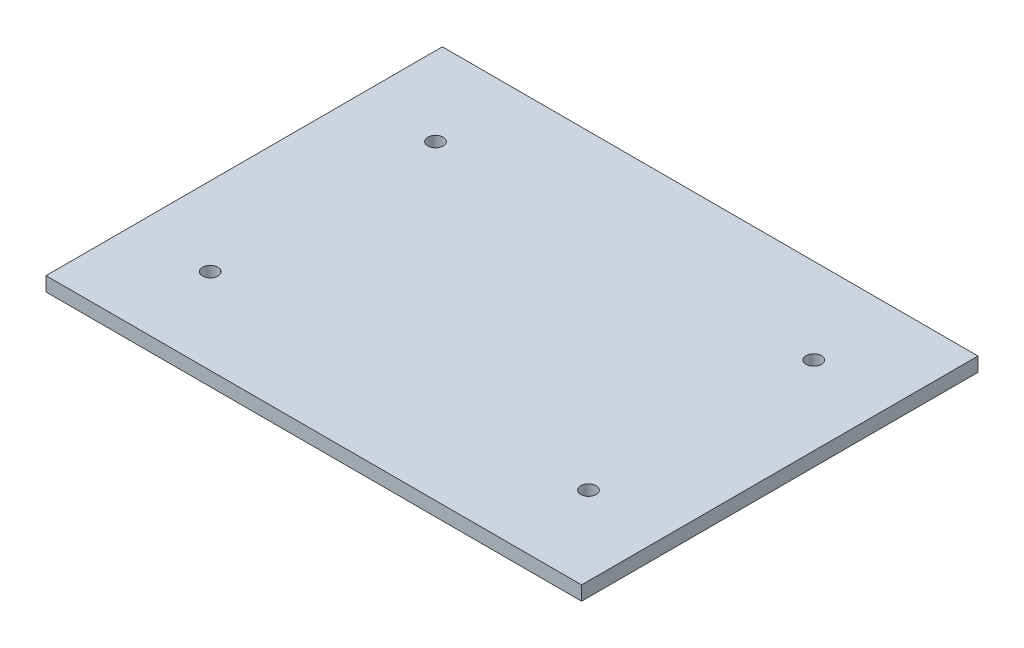
ISO-10303-21;
HEADER;
FILE_DESCRIPTION(('STEP AP214'),'2;1');
FILE_NAME('part.step','',(''),(''),'','','');
FILE_SCHEMA(('AUTOMOTIVE_DESIGN { 1 0 10303 214 1 1 1 1 }'));
ENDSEC;
DATA;
#1=APPLICATION_CONTEXT('core data for automotive mechanical design processes');
#2=APPLICATION_PROTOCOL_DEFINITION('international standard','automotive_design',2000,#1);
#3=PRODUCT_CONTEXT('',#1,'mechanical');
#4=PRODUCT('Part','Part','',(#3));
#5=PRODUCT_RELATED_PRODUCT_CATEGORY('part','',(#4));
#6=PRODUCT_DEFINITION_FORMATION('','',#4);
#7=PRODUCT_DEFINITION_CONTEXT('part definition',#1,'design');
#8=PRODUCT_DEFINITION('design','',#6,#7);
#9=PRODUCT_DEFINITION_SHAPE('','',#8);
#10=(LENGTH_UNIT() NAMED_UNIT(*) SI_UNIT(.MILLI.,.METRE.));
#11=(NAMED_UNIT(*) PLANE_ANGLE_UNIT() SI_UNIT($,.RADIAN.));
#12=(NAMED_UNIT(*) SI_UNIT($,.STERADIAN.) SOLID_ANGLE_UNIT());
#13=UNCERTAINTY_MEASURE_WITH_UNIT(LENGTH_MEASURE(1.E-05),#10,'distance_accuracy_value','');
#14=(GEOMETRIC_REPRESENTATION_CONTEXT(3) GLOBAL_UNCERTAINTY_ASSIGNED_CONTEXT((#13)) GLOBAL_UNIT_ASSIGNED_CONTEXT((#10,
#11,#12)) REPRESENTATION_CONTEXT('',''));
#15=CARTESIAN_POINT('',(0.,0.,0.));
#16=DIRECTION('',(0.,0.,1.));
#17=DIRECTION('',(1.,0.,0.));
#18=AXIS2_PLACEMENT_3D('',#15,#16,#17);
#19=CARTESIAN_POINT('',(-104.26373225451,6.,-42.6720333552661));
#20=DIRECTION('',(1.,0.,0.));
#21=DIRECTION('',(0.,0.,-1.));
#22=AXIS2_PLACEMENT_3D('',#19,#20,#21);
#23=PLANE('',#22);
#24=DIRECTION('',(0.,0.,1.));
#25=VECTOR('',#24,1.);
#26=CARTESIAN_POINT('',(-104.26373225451,0.,-42.6720333552661));
#27=LINE('',#26,#25);
#28=CARTESIAN_POINT('',(-104.26373225451,0.,-42.6720333552661));
#29=VERTEX_POINT('',#28);
#30=CARTESIAN_POINT('',(-104.26373225451,0.,125.327966644734));
#31=VERTEX_POINT('',#30);
#32=EDGE_CURVE('E99',#29,#31,#27,.T.);
#33=ORIENTED_EDGE('',*,*,#32,.T.);
#34=DIRECTION('',(0.,-1.,0.));
#35=VECTOR('',#34,1.);
#36=CARTESIAN_POINT('',(-104.26373225451,6.,125.327966644734));
#37=LINE('',#36,#35);
#38=CARTESIAN_POINT('',(-104.26373225451,6.,125.327966644734));
#39=VERTEX_POINT('',#38);
#40=EDGE_CURVE('E11',#39,#31,#37,.T.);
#41=ORIENTED_EDGE('',*,*,#40,.F.);
#42=DIRECTION('',(0.,0.,1.));
#43=VECTOR('',#42,1.);
#44=CARTESIAN_POINT('',(-104.26373225451,6.,-42.6720333552661));
#45=LINE('',#44,#43);
#46=CARTESIAN_POINT('',(-104.26373225451,6.,-42.6720333552661));
#47=VERTEX_POINT('',#46);
#48=EDGE_CURVE('E86',#47,#39,#45,.T.);
#49=ORIENTED_EDGE('',*,*,#48,.F.);
#50=DIRECTION('',(0.,-1.,0.));
#51=VECTOR('',#50,1.);
#52=CARTESIAN_POINT('',(-104.26373225451,6.,-42.6720333552661));
#53=LINE('',#52,#51);
#54=EDGE_CURVE('E95',#47,#29,#53,.T.);
#55=ORIENTED_EDGE('',*,*,#54,.T.);
#56=EDGE_LOOP('',(#33,#41,#49,#55));
#57=FACE_BOUND('',#56,.T.);
#58=ADVANCED_FACE('F33',(#57),#23,.F.);
#59=CARTESIAN_POINT('',(-104.26373225451,6.,125.327966644734));
#60=DIRECTION('',(0.,0.,-1.));
#61=DIRECTION('',(-1.,0.,0.));
#62=AXIS2_PLACEMENT_3D('',#59,#60,#61);
#63=PLANE('',#62);
#64=DIRECTION('',(1.,0.,0.));
#65=VECTOR('',#64,1.);
#66=CARTESIAN_POINT('',(-104.26373225451,0.,125.327966644734));
#67=LINE('',#66,#65);
#68=CARTESIAN_POINT('',(122.73626774549,0.,125.327966644734));
#69=VERTEX_POINT('',#68);
#70=EDGE_CURVE('E90',#31,#69,#67,.T.);
#71=ORIENTED_EDGE('',*,*,#70,.T.);
#72=DIRECTION('',(0.,-1.,0.));
#73=VECTOR('',#72,1.);
#74=CARTESIAN_POINT('',(122.73626774549,6.,125.327966644734));
#75=LINE('',#74,#73);
#76=CARTESIAN_POINT('',(122.73626774549,6.,125.327966644734));
#77=VERTEX_POINT('',#76);
#78=EDGE_CURVE('E42',#77,#69,#75,.T.);
#79=ORIENTED_EDGE('',*,*,#78,.F.);
#80=DIRECTION('',(1.,0.,0.));
#81=VECTOR('',#80,1.);
#82=CARTESIAN_POINT('',(-104.26373225451,6.,125.327966644734));
#83=LINE('',#82,#81);
#84=EDGE_CURVE('E81',#39,#77,#83,.T.);
#85=ORIENTED_EDGE('',*,*,#84,.F.);
#86=ORIENTED_EDGE('',*,*,#40,.T.);
#87=EDGE_LOOP('',(#71,#79,#85,#86));
#88=FACE_BOUND('',#87,.T.);
#89=ADVANCED_FACE('F89',(#88),#63,.F.);
#90=CARTESIAN_POINT('',(122.73626774549,6.,-42.6720333552661));
#91=DIRECTION('',(-1.,0.,0.));
#92=DIRECTION('',(0.,0.,1.));
#93=AXIS2_PLACEMENT_3D('',#90,#91,#92);
#94=PLANE('',#93);
#95=DIRECTION('',(0.,0.,-1.));
#96=VECTOR('',#95,1.);
#97=CARTESIAN_POINT('',(122.73626774549,0.,-42.6720333552661));
#98=LINE('',#97,#96);
#99=CARTESIAN_POINT('',(122.73626774549,0.,-42.6720333552661));
#100=VERTEX_POINT('',#99);
#101=EDGE_CURVE('E68',#69,#100,#98,.T.);
#102=ORIENTED_EDGE('',*,*,#101,.T.);
#103=DIRECTION('',(0.,-1.,0.));
#104=VECTOR('',#103,1.);
#105=CARTESIAN_POINT('',(122.73626774549,6.,-42.6720333552661));
#106=LINE('',#105,#104);
#107=CARTESIAN_POINT('',(122.73626774549,6.,-42.6720333552661));
#108=VERTEX_POINT('',#107);
#109=EDGE_CURVE('E91',#108,#100,#106,.T.);
#110=ORIENTED_EDGE('',*,*,#109,.F.);
#111=DIRECTION('',(0.,0.,-1.));
#112=VECTOR('',#111,1.);
#113=CARTESIAN_POINT('',(122.73626774549,6.,-42.6720333552661));
#114=LINE('',#113,#112);
#115=EDGE_CURVE('E84',#77,#108,#114,.T.);
#116=ORIENTED_EDGE('',*,*,#115,.F.);
#117=ORIENTED_EDGE('',*,*,#78,.T.);
#118=EDGE_LOOP('',(#102,#110,#116,#117));
#119=FACE_BOUND('',#118,.T.);
#120=ADVANCED_FACE('F93',(#119),#94,.F.);
#121=CARTESIAN_POINT('',(-104.26373225451,6.,-42.6720333552661));
#122=DIRECTION('',(0.,0.,1.));
#123=DIRECTION('',(1.,0.,0.));
#124=AXIS2_PLACEMENT_3D('',#121,#122,#123);
#125=PLANE('',#124);
#126=DIRECTION('',(-1.,0.,0.));
#127=VECTOR('',#126,1.);
#128=CARTESIAN_POINT('',(-104.26373225451,0.,-42.6720333552661));
#129=LINE('',#128,#127);
#130=EDGE_CURVE('E74',#100,#29,#129,.T.);
#131=ORIENTED_EDGE('',*,*,#130,.T.);
#132=ORIENTED_EDGE('',*,*,#54,.F.);
#133=DIRECTION('',(-1.,0.,0.));
#134=VECTOR('',#133,1.);
#135=CARTESIAN_POINT('',(-104.26373225451,6.,-42.6720333552661));
#136=LINE('',#135,#134);
#137=EDGE_CURVE('E51',#108,#47,#136,.T.);
#138=ORIENTED_EDGE('',*,*,#137,.F.);
#139=ORIENTED_EDGE('',*,*,#109,.T.);
#140=EDGE_LOOP('',(#131,#132,#138,#139));
#141=FACE_BOUND('',#140,.T.);
#142=ADVANCED_FACE('F151',(#141),#125,.F.);
#143=CARTESIAN_POINT('',(0.,6.,0.));
#144=DIRECTION('',(0.,1.,0.));
#145=DIRECTION('',(0.,0.,1.));
#146=AXIS2_PLACEMENT_3D('',#143,#144,#145);
#147=PLANE('',#146);
#148=CARTESIAN_POINT('',(-70.9373171534123,6.,-6.42432530132062));
#149=DIRECTION('',(0.,1.,0.));
#150=DIRECTION('',(0.,0.,1.));
#151=AXIS2_PLACEMENT_3D('',#148,#149,#150);
#152=CIRCLE('',#151,3.25000000000001);
#153=CARTESIAN_POINT('',(-70.9373171534123,6.,-3.17432530132061));
#154=VERTEX_POINT('',#153);
#155=EDGE_CURVE('E217',#154,#154,#152,.T.);
#156=ORIENTED_EDGE('',*,*,#155,.F.);
#157=EDGE_LOOP('',(#156));
#158=FACE_BOUND('',#157,.T.);
#159=CARTESIAN_POINT('',(89.4098526443914,6.,89.0802585907885));
#160=DIRECTION('',(0.,1.,0.));
#161=DIRECTION('',(0.,0.,1.));
#162=AXIS2_PLACEMENT_3D('',#159,#160,#161);
#163=CIRCLE('',#162,3.25000000000001);
#164=CARTESIAN_POINT('',(89.4098526443914,6.,92.3302585907885));
#165=VERTEX_POINT('',#164);
#166=EDGE_CURVE('E212',#165,#165,#163,.T.);
#167=ORIENTED_EDGE('',*,*,#166,.F.);
#168=EDGE_LOOP('',(#167));
#169=FACE_BOUND('',#168,.T.);
#170=CARTESIAN_POINT('',(89.4098526443914,6.,-6.42432530132062));
#171=DIRECTION('',(0.,1.,0.));
#172=DIRECTION('',(0.,0.,1.));
#173=AXIS2_PLACEMENT_3D('',#170,#171,#172);
#174=CIRCLE('',#173,3.25000000000001);
#175=CARTESIAN_POINT('',(89.4098526443914,6.,-3.17432530132061));
#176=VERTEX_POINT('',#175);
#177=EDGE_CURVE('E205',#176,#176,#174,.T.);
#178=ORIENTED_EDGE('',*,*,#177,.F.);
#179=EDGE_LOOP('',(#178));
#180=FACE_BOUND('',#179,.T.);
#181=CARTESIAN_POINT('',(-70.9373171534123,6.,89.0802585907885));
#182=DIRECTION('',(0.,1.,0.));
#183=DIRECTION('',(0.,0.,1.));
#184=AXIS2_PLACEMENT_3D('',#181,#182,#183);
#185=CIRCLE('',#184,3.25000000000001);
#186=CARTESIAN_POINT('',(-70.9373171534123,6.,92.3302585907885));
#187=VERTEX_POINT('',#186);
#188=EDGE_CURVE('E111',#187,#187,#185,.T.);
#189=ORIENTED_EDGE('',*,*,#188,.F.);
#190=EDGE_LOOP('',(#189));
#191=FACE_BOUND('',#190,.T.);
#192=ORIENTED_EDGE('',*,*,#48,.T.);
#193=ORIENTED_EDGE('',*,*,#84,.T.);
#194=ORIENTED_EDGE('',*,*,#115,.T.);
#195=ORIENTED_EDGE('',*,*,#137,.T.);
#196=EDGE_LOOP('',(#192,#193,#194,#195));
#197=FACE_BOUND('',#196,.T.);
#198=ADVANCED_FACE('F82',(#158,#169,#180,#191,#197),#147,.T.);
#199=CARTESIAN_POINT('',(0.,0.,0.));
#200=DIRECTION('',(0.,1.,0.));
#201=DIRECTION('',(0.,0.,1.));
#202=AXIS2_PLACEMENT_3D('',#199,#200,#201);
#203=PLANE('',#202);
#204=CARTESIAN_POINT('',(-70.9373171534123,0.,-6.42432530132062));
#205=DIRECTION('',(0.,1.,0.));
#206=DIRECTION('',(0.,0.,1.));
#207=AXIS2_PLACEMENT_3D('',#204,#205,#206);
#208=CIRCLE('',#207,3.25000000000001);
#209=CARTESIAN_POINT('',(-70.9373171534123,0.,-3.17432530132061));
#210=VERTEX_POINT('',#209);
#211=EDGE_CURVE('E36',#210,#210,#208,.T.);
#212=ORIENTED_EDGE('',*,*,#211,.T.);
#213=EDGE_LOOP('',(#212));
#214=FACE_BOUND('',#213,.T.);
#215=CARTESIAN_POINT('',(89.4098526443914,0.,89.0802585907885));
#216=DIRECTION('',(0.,1.,0.));
#217=DIRECTION('',(0.,0.,1.));
#218=AXIS2_PLACEMENT_3D('',#215,#216,#217);
#219=CIRCLE('',#218,3.25000000000001);
#220=CARTESIAN_POINT('',(89.4098526443914,0.,92.3302585907885));
#221=VERTEX_POINT('',#220);
#222=EDGE_CURVE('E113',#221,#221,#219,.T.);
#223=ORIENTED_EDGE('',*,*,#222,.T.);
#224=EDGE_LOOP('',(#223));
#225=FACE_BOUND('',#224,.T.);
#226=CARTESIAN_POINT('',(89.4098526443914,0.,-6.42432530132062));
#227=DIRECTION('',(0.,1.,0.));
#228=DIRECTION('',(0.,0.,1.));
#229=AXIS2_PLACEMENT_3D('',#226,#227,#228);
#230=CIRCLE('',#229,3.25000000000001);
#231=CARTESIAN_POINT('',(89.4098526443914,0.,-3.17432530132061));
#232=VERTEX_POINT('',#231);
#233=EDGE_CURVE('E110',#232,#232,#230,.T.);
#234=ORIENTED_EDGE('',*,*,#233,.T.);
#235=EDGE_LOOP('',(#234));
#236=FACE_BOUND('',#235,.T.);
#237=CARTESIAN_POINT('',(-70.9373171534123,0.,89.0802585907885));
#238=DIRECTION('',(0.,1.,0.));
#239=DIRECTION('',(0.,0.,1.));
#240=AXIS2_PLACEMENT_3D('',#237,#238,#239);
#241=CIRCLE('',#240,3.25000000000001);
#242=CARTESIAN_POINT('',(-70.9373171534123,0.,92.3302585907885));
#243=VERTEX_POINT('',#242);
#244=EDGE_CURVE('E107',#243,#243,#241,.T.);
#245=ORIENTED_EDGE('',*,*,#244,.T.);
#246=EDGE_LOOP('',(#245));
#247=FACE_BOUND('',#246,.T.);
#248=ORIENTED_EDGE('',*,*,#32,.F.);
#249=ORIENTED_EDGE('',*,*,#130,.F.);
#250=ORIENTED_EDGE('',*,*,#101,.F.);
#251=ORIENTED_EDGE('',*,*,#70,.F.);
#252=EDGE_LOOP('',(#248,#249,#250,#251));
#253=FACE_BOUND('',#252,.T.);
#254=ADVANCED_FACE('F120',(#214,#225,#236,#247,#253),#203,.F.);
#255=CARTESIAN_POINT('',(-70.9373171534123,-4.,89.0802585907885));
#256=DIRECTION('',(0.,1.,0.));
#257=DIRECTION('',(0.,0.,1.));
#258=AXIS2_PLACEMENT_3D('',#255,#256,#257);
#259=CYLINDRICAL_SURFACE('',#258,3.25000000000001);
#260=ORIENTED_EDGE('',*,*,#188,.T.);
#261=EDGE_LOOP('',(#260));
#262=FACE_BOUND('',#261,.T.);
#263=ORIENTED_EDGE('',*,*,#244,.F.);
#264=EDGE_LOOP('',(#263));
#265=FACE_BOUND('',#264,.T.);
#266=ADVANCED_FACE('F143',(#262,#265),#259,.F.);
#267=CARTESIAN_POINT('',(89.4098526443914,-4.,-6.42432530132062));
#268=DIRECTION('',(0.,1.,0.));
#269=DIRECTION('',(0.,0.,1.));
#270=AXIS2_PLACEMENT_3D('',#267,#268,#269);
#271=CYLINDRICAL_SURFACE('',#270,3.25000000000001);
#272=ORIENTED_EDGE('',*,*,#177,.T.);
#273=EDGE_LOOP('',(#272));
#274=FACE_BOUND('',#273,.T.);
#275=ORIENTED_EDGE('',*,*,#233,.F.);
#276=EDGE_LOOP('',(#275));
#277=FACE_BOUND('',#276,.T.);
#278=ADVANCED_FACE('F130',(#274,#277),#271,.F.);
#279=CARTESIAN_POINT('',(89.4098526443914,-4.,89.0802585907885));
#280=DIRECTION('',(0.,1.,0.));
#281=DIRECTION('',(0.,0.,1.));
#282=AXIS2_PLACEMENT_3D('',#279,#280,#281);
#283=CYLINDRICAL_SURFACE('',#282,3.25000000000001);
#284=ORIENTED_EDGE('',*,*,#166,.T.);
#285=EDGE_LOOP('',(#284));
#286=FACE_BOUND('',#285,.T.);
#287=ORIENTED_EDGE('',*,*,#222,.F.);
#288=EDGE_LOOP('',(#287));
#289=FACE_BOUND('',#288,.T.);
#290=ADVANCED_FACE('F124',(#286,#289),#283,.F.);
#291=CARTESIAN_POINT('',(-70.9373171534123,-4.,-6.42432530132062));
#292=DIRECTION('',(0.,1.,0.));
#293=DIRECTION('',(0.,0.,1.));
#294=AXIS2_PLACEMENT_3D('',#291,#292,#293);
#295=CYLINDRICAL_SURFACE('',#294,3.25000000000001);
#296=ORIENTED_EDGE('',*,*,#155,.T.);
#297=EDGE_LOOP('',(#296));
#298=FACE_BOUND('',#297,.T.);
#299=ORIENTED_EDGE('',*,*,#211,.F.);
#300=EDGE_LOOP('',(#299));
#301=FACE_BOUND('',#300,.T.);
#302=ADVANCED_FACE('F122',(#298,#301),#295,.F.);
#303=CLOSED_SHELL('',(#58,#89,#120,#142,#198,#254,#266,#278,#290,#302));
#304=MANIFOLD_SOLID_BREP('B2',#303);
#305=ADVANCED_BREP_SHAPE_REPRESENTATION('',(#18,#304),#14);
#306=SHAPE_DEFINITION_REPRESENTATION(#9,#305);
ENDSEC;
END-ISO-10303-21;
